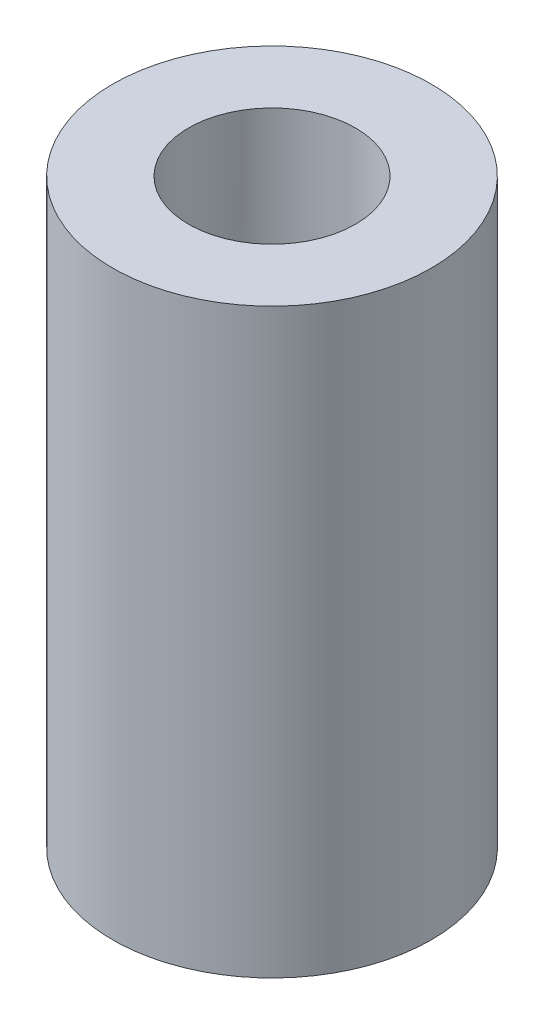
ISO-10303-21;
HEADER;
FILE_DESCRIPTION(('STEP AP214'),'2;1');
FILE_NAME('part.step','',(''),(''),'','','');
FILE_SCHEMA(('AUTOMOTIVE_DESIGN { 1 0 10303 214 1 1 1 1 }'));
ENDSEC;
DATA;
#1=APPLICATION_CONTEXT('core data for automotive mechanical design processes');
#2=APPLICATION_PROTOCOL_DEFINITION('international standard','automotive_design',2000,#1);
#3=PRODUCT_CONTEXT('',#1,'mechanical');
#4=PRODUCT('Part','Part','',(#3));
#5=PRODUCT_RELATED_PRODUCT_CATEGORY('part','',(#4));
#6=PRODUCT_DEFINITION_FORMATION('','',#4);
#7=PRODUCT_DEFINITION_CONTEXT('part definition',#1,'design');
#8=PRODUCT_DEFINITION('design','',#6,#7);
#9=PRODUCT_DEFINITION_SHAPE('','',#8);
#10=(LENGTH_UNIT() NAMED_UNIT(*) SI_UNIT(.MILLI.,.METRE.));
#11=(NAMED_UNIT(*) PLANE_ANGLE_UNIT() SI_UNIT($,.RADIAN.));
#12=(NAMED_UNIT(*) SI_UNIT($,.STERADIAN.) SOLID_ANGLE_UNIT());
#13=UNCERTAINTY_MEASURE_WITH_UNIT(LENGTH_MEASURE(1.E-05),#10,'distance_accuracy_value','');
#14=(GEOMETRIC_REPRESENTATION_CONTEXT(3) GLOBAL_UNCERTAINTY_ASSIGNED_CONTEXT((#13)) GLOBAL_UNIT_ASSIGNED_CONTEXT((#10,
#11,#12)) REPRESENTATION_CONTEXT('',''));
#15=CARTESIAN_POINT('',(0.,0.,0.));
#16=DIRECTION('',(0.,0.,1.));
#17=DIRECTION('',(1.,0.,0.));
#18=AXIS2_PLACEMENT_3D('',#15,#16,#17);
#19=CARTESIAN_POINT('',(0.,0.,0.));
#20=DIRECTION('',(0.,1.,0.));
#21=DIRECTION('',(1.,0.,0.));
#22=AXIS2_PLACEMENT_3D('',#19,#20,#21);
#23=PLANE('',#22);
#24=CARTESIAN_POINT('',(0.,0.,0.));
#25=DIRECTION('',(0.,1.,0.));
#26=DIRECTION('',(-1.,0.,0.));
#27=AXIS2_PLACEMENT_3D('',#24,#25,#26);
#28=CIRCLE('',#27,3.15);
#29=CARTESIAN_POINT('',(-3.15,0.,0.));
#30=VERTEX_POINT('',#29);
#31=EDGE_CURVE('E29',#30,#30,#28,.T.);
#32=ORIENTED_EDGE('',*,*,#31,.F.);
#33=EDGE_LOOP('',(#32));
#34=FACE_BOUND('',#33,.T.);
#35=CARTESIAN_POINT('',(0.,0.,0.));
#36=DIRECTION('',(0.,-1.,0.));
#37=DIRECTION('',(-1.,0.,0.));
#38=AXIS2_PLACEMENT_3D('',#35,#36,#37);
#39=CIRCLE('',#38,1.65);
#40=CARTESIAN_POINT('',(-1.65,0.,0.));
#41=VERTEX_POINT('',#40);
#42=EDGE_CURVE('E10',#41,#41,#39,.T.);
#43=ORIENTED_EDGE('',*,*,#42,.F.);
#44=EDGE_LOOP('',(#43));
#45=FACE_BOUND('',#44,.T.);
#46=ADVANCED_FACE('F15',(#34,#45),#23,.F.);
#47=CARTESIAN_POINT('',(0.,0.,0.));
#48=DIRECTION('',(0.,1.,0.));
#49=DIRECTION('',(1.,0.,0.));
#50=AXIS2_PLACEMENT_3D('',#47,#48,#49);
#51=CYLINDRICAL_SURFACE('',#50,1.65);
#52=CARTESIAN_POINT('',(0.,11.5,0.));
#53=DIRECTION('',(0.,-1.,0.));
#54=DIRECTION('',(1.,0.,0.));
#55=AXIS2_PLACEMENT_3D('',#52,#53,#54);
#56=CIRCLE('',#55,1.65);
#57=CARTESIAN_POINT('',(1.65,11.5,0.));
#58=VERTEX_POINT('',#57);
#59=EDGE_CURVE('E27',#58,#58,#56,.T.);
#60=ORIENTED_EDGE('',*,*,#59,.F.);
#61=EDGE_LOOP('',(#60));
#62=FACE_BOUND('',#61,.T.);
#63=ORIENTED_EDGE('',*,*,#42,.T.);
#64=EDGE_LOOP('',(#63));
#65=FACE_BOUND('',#64,.T.);
#66=ADVANCED_FACE('F39',(#62,#65),#51,.F.);
#67=CARTESIAN_POINT('',(0.,11.5,0.));
#68=DIRECTION('',(0.,1.,0.));
#69=DIRECTION('',(1.,0.,0.));
#70=AXIS2_PLACEMENT_3D('',#67,#68,#69);
#71=PLANE('',#70);
#72=CARTESIAN_POINT('',(0.,11.5,0.));
#73=DIRECTION('',(0.,1.,0.));
#74=DIRECTION('',(-1.,0.,0.));
#75=AXIS2_PLACEMENT_3D('',#72,#73,#74);
#76=CIRCLE('',#75,3.15);
#77=CARTESIAN_POINT('',(-3.15,11.5,0.));
#78=VERTEX_POINT('',#77);
#79=EDGE_CURVE('E19',#78,#78,#76,.T.);
#80=ORIENTED_EDGE('',*,*,#79,.T.);
#81=EDGE_LOOP('',(#80));
#82=FACE_BOUND('',#81,.T.);
#83=ORIENTED_EDGE('',*,*,#59,.T.);
#84=EDGE_LOOP('',(#83));
#85=FACE_BOUND('',#84,.T.);
#86=ADVANCED_FACE('F45',(#82,#85),#71,.T.);
#87=CARTESIAN_POINT('',(0.,0.,0.));
#88=DIRECTION('',(0.,1.,0.));
#89=DIRECTION('',(1.,0.,0.));
#90=AXIS2_PLACEMENT_3D('',#87,#88,#89);
#91=CYLINDRICAL_SURFACE('',#90,3.15);
#92=ORIENTED_EDGE('',*,*,#79,.F.);
#93=EDGE_LOOP('',(#92));
#94=FACE_BOUND('',#93,.T.);
#95=ORIENTED_EDGE('',*,*,#31,.T.);
#96=EDGE_LOOP('',(#95));
#97=FACE_BOUND('',#96,.T.);
#98=ADVANCED_FACE('F17',(#94,#97),#91,.T.);
#99=CLOSED_SHELL('',(#46,#66,#86,#98));
#100=MANIFOLD_SOLID_BREP('B1',#99);
#101=ADVANCED_BREP_SHAPE_REPRESENTATION('',(#18,#100),#14);
#102=SHAPE_DEFINITION_REPRESENTATION(#9,#101);
ENDSEC;
END-ISO-10303-21;
